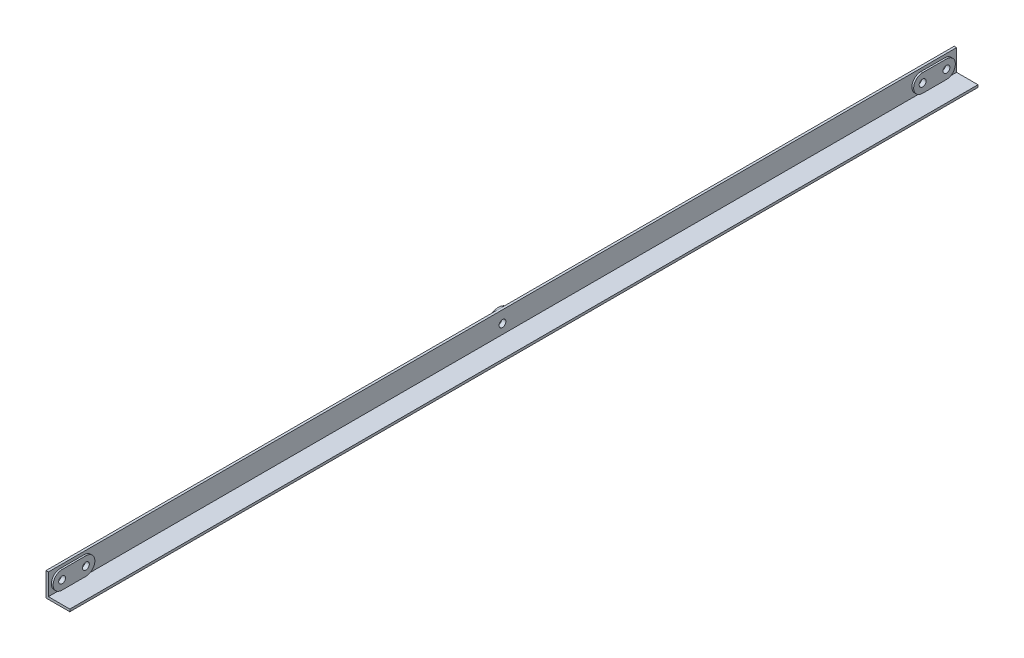
ISO-10303-21;
HEADER;
FILE_DESCRIPTION(('STEP AP214'),'2;1');
FILE_NAME('part.step','',(''),(''),'','','');
FILE_SCHEMA(('AUTOMOTIVE_DESIGN { 1 0 10303 214 1 1 1 1 }'));
ENDSEC;
DATA;
#1=APPLICATION_CONTEXT('core data for automotive mechanical design processes');
#2=APPLICATION_PROTOCOL_DEFINITION('international standard','automotive_design',2000,#1);
#3=PRODUCT_CONTEXT('',#1,'mechanical');
#4=PRODUCT('Part','Part','',(#3));
#5=PRODUCT_RELATED_PRODUCT_CATEGORY('part','',(#4));
#6=PRODUCT_DEFINITION_FORMATION('','',#4);
#7=PRODUCT_DEFINITION_CONTEXT('part definition',#1,'design');
#8=PRODUCT_DEFINITION('design','',#6,#7);
#9=PRODUCT_DEFINITION_SHAPE('','',#8);
#10=(LENGTH_UNIT() NAMED_UNIT(*) SI_UNIT(.MILLI.,.METRE.));
#11=(NAMED_UNIT(*) PLANE_ANGLE_UNIT() SI_UNIT($,.RADIAN.));
#12=(NAMED_UNIT(*) SI_UNIT($,.STERADIAN.) SOLID_ANGLE_UNIT());
#13=UNCERTAINTY_MEASURE_WITH_UNIT(LENGTH_MEASURE(1.E-05),#10,'distance_accuracy_value','');
#14=(GEOMETRIC_REPRESENTATION_CONTEXT(3) GLOBAL_UNCERTAINTY_ASSIGNED_CONTEXT((#13)) GLOBAL_UNIT_ASSIGNED_CONTEXT((#10,
#11,#12)) REPRESENTATION_CONTEXT('',''));
#15=CARTESIAN_POINT('',(0.,0.,0.));
#16=DIRECTION('',(0.,0.,1.));
#17=DIRECTION('',(1.,0.,0.));
#18=AXIS2_PLACEMENT_3D('',#15,#16,#17);
#19=CARTESIAN_POINT('',(0.,0.,3050.));
#20=DIRECTION('',(1.,0.,0.));
#21=DIRECTION('',(0.,0.,-1.));
#22=AXIS2_PLACEMENT_3D('',#19,#20,#21);
#23=PLANE('',#22);
#24=CARTESIAN_POINT('',(0.,40.,40.));
#25=DIRECTION('',(1.,0.,0.));
#26=DIRECTION('',(0.,0.,-1.));
#27=AXIS2_PLACEMENT_3D('',#24,#25,#26);
#28=CIRCLE('',#27,11.4999999999997);
#29=CARTESIAN_POINT('',(0.,40.,28.5000000000003));
#30=VERTEX_POINT('',#29);
#31=EDGE_CURVE('E284',#30,#30,#28,.T.);
#32=ORIENTED_EDGE('',*,*,#31,.T.);
#33=EDGE_LOOP('',(#32));
#34=FACE_BOUND('',#33,.T.);
#35=CARTESIAN_POINT('',(0.,40.,1525.));
#36=DIRECTION('',(-1.,0.,0.));
#37=DIRECTION('',(0.,0.,1.));
#38=AXIS2_PLACEMENT_3D('',#35,#36,#37);
#39=CIRCLE('',#38,39.9999999999999);
#40=CARTESIAN_POINT('',(0.,79.9999999999999,1525.));
#41=VERTEX_POINT('',#40);
#42=CARTESIAN_POINT('',(0.,0.,1525.));
#43=VERTEX_POINT('',#42);
#44=EDGE_CURVE('E222',#41,#43,#39,.T.);
#45=ORIENTED_EDGE('',*,*,#44,.F.);
#46=DIRECTION('',(0.,0.,-1.));
#47=VECTOR('',#46,1.);
#48=CARTESIAN_POINT('',(0.,80.,3050.));
#49=LINE('',#48,#47);
#50=CARTESIAN_POINT('',(0.,80.,0.));
#51=VERTEX_POINT('',#50);
#52=EDGE_CURVE('E259',#41,#51,#49,.T.);
#53=ORIENTED_EDGE('',*,*,#52,.T.);
#54=DIRECTION('',(0.,-1.,0.));
#55=VECTOR('',#54,1.);
#56=CARTESIAN_POINT('',(0.,0.,0.));
#57=LINE('',#56,#55);
#58=CARTESIAN_POINT('',(0.,0.,0.));
#59=VERTEX_POINT('',#58);
#60=EDGE_CURVE('E244',#51,#59,#57,.T.);
#61=ORIENTED_EDGE('',*,*,#60,.T.);
#62=DIRECTION('',(0.,0.,-1.));
#63=VECTOR('',#62,1.);
#64=CARTESIAN_POINT('',(0.,0.,3050.));
#65=LINE('',#64,#63);
#66=EDGE_CURVE('E274',#43,#59,#65,.T.);
#67=ORIENTED_EDGE('',*,*,#66,.F.);
#68=EDGE_LOOP('',(#45,#53,#61,#67));
#69=FACE_BOUND('',#68,.T.);
#70=CARTESIAN_POINT('',(0.,40.,120.));
#71=DIRECTION('',(1.,0.,0.));
#72=DIRECTION('',(0.,0.,-1.));
#73=AXIS2_PLACEMENT_3D('',#70,#71,#72);
#74=CIRCLE('',#73,11.4999999999997);
#75=CARTESIAN_POINT('',(0.,40.,108.5));
#76=VERTEX_POINT('',#75);
#77=EDGE_CURVE('E291',#76,#76,#74,.T.);
#78=ORIENTED_EDGE('',*,*,#77,.T.);
#79=EDGE_LOOP('',(#78));
#80=FACE_BOUND('',#79,.T.);
#81=ADVANCED_FACE('F34',(#34,#69,#80),#23,.F.);
#82=CARTESIAN_POINT('',(14.,40.,40.));
#83=DIRECTION('',(1.,0.,0.));
#84=DIRECTION('',(0.,1.,0.));
#85=AXIS2_PLACEMENT_3D('',#82,#83,#84);
#86=PLANE('',#85);
#87=CARTESIAN_POINT('',(14.,40.,40.));
#88=DIRECTION('',(1.,0.,0.));
#89=DIRECTION('',(0.,1.,0.));
#90=AXIS2_PLACEMENT_3D('',#87,#88,#89);
#91=CIRCLE('',#90,11.4999999999997);
#92=CARTESIAN_POINT('',(14.,51.4999999999997,40.));
#93=VERTEX_POINT('',#92);
#94=EDGE_CURVE('E173',#93,#93,#91,.F.);
#95=ORIENTED_EDGE('',*,*,#94,.T.);
#96=EDGE_LOOP('',(#95));
#97=FACE_BOUND('',#96,.T.);
#98=CARTESIAN_POINT('',(14.,40.,40.));
#99=DIRECTION('',(-1.,0.,0.));
#100=DIRECTION('',(0.,1.,0.));
#101=AXIS2_PLACEMENT_3D('',#98,#99,#100);
#102=CIRCLE('',#101,29.9999999999998);
#103=CARTESIAN_POINT('',(14.,70.,40.));
#104=VERTEX_POINT('',#103);
#105=CARTESIAN_POINT('',(14.,10.,40.));
#106=VERTEX_POINT('',#105);
#107=EDGE_CURVE('E180',#104,#106,#102,.T.);
#108=ORIENTED_EDGE('',*,*,#107,.F.);
#109=DIRECTION('',(0.,0.,-1.));
#110=VECTOR('',#109,1.);
#111=CARTESIAN_POINT('',(14.,70.,40.));
#112=LINE('',#111,#110);
#113=CARTESIAN_POINT('',(14.,69.9999999999998,120.));
#114=VERTEX_POINT('',#113);
#115=EDGE_CURVE('E151',#114,#104,#112,.T.);
#116=ORIENTED_EDGE('',*,*,#115,.F.);
#117=CARTESIAN_POINT('',(14.,40.,120.));
#118=DIRECTION('',(-1.,0.,0.));
#119=DIRECTION('',(0.,1.,0.));
#120=AXIS2_PLACEMENT_3D('',#117,#118,#119);
#121=CIRCLE('',#120,29.9999999999998);
#122=CARTESIAN_POINT('',(14.,10.,120.));
#123=VERTEX_POINT('',#122);
#124=EDGE_CURVE('E143',#123,#114,#121,.T.);
#125=ORIENTED_EDGE('',*,*,#124,.F.);
#126=DIRECTION('',(0.,0.,1.));
#127=VECTOR('',#126,1.);
#128=CARTESIAN_POINT('',(14.,10.,40.));
#129=LINE('',#128,#127);
#130=EDGE_CURVE('E149',#106,#123,#129,.T.);
#131=ORIENTED_EDGE('',*,*,#130,.F.);
#132=EDGE_LOOP('',(#108,#116,#125,#131));
#133=FACE_BOUND('',#132,.T.);
#134=CARTESIAN_POINT('',(14.,40.,120.));
#135=DIRECTION('',(1.,0.,0.));
#136=DIRECTION('',(0.,1.,0.));
#137=AXIS2_PLACEMENT_3D('',#134,#135,#136);
#138=CIRCLE('',#137,11.4999999999997);
#139=CARTESIAN_POINT('',(14.,51.4999999999997,120.));
#140=VERTEX_POINT('',#139);
#141=EDGE_CURVE('E37',#140,#140,#138,.F.);
#142=ORIENTED_EDGE('',*,*,#141,.T.);
#143=EDGE_LOOP('',(#142));
#144=FACE_BOUND('',#143,.T.);
#145=ADVANCED_FACE('F146',(#97,#133,#144),#86,.T.);
#146=CARTESIAN_POINT('',(14.,40.,40.));
#147=DIRECTION('',(-1.,0.,0.));
#148=DIRECTION('',(0.,-1.,0.));
#149=AXIS2_PLACEMENT_3D('',#146,#147,#148);
#150=CYLINDRICAL_SURFACE('',#149,29.9999999999998);
#151=CARTESIAN_POINT('',(8.,40.,40.));
#152=DIRECTION('',(-1.,0.,0.));
#153=DIRECTION('',(0.,1.,0.));
#154=AXIS2_PLACEMENT_3D('',#151,#152,#153);
#155=CIRCLE('',#154,29.9999999999998);
#156=CARTESIAN_POINT('',(8.,69.9999999999998,40.));
#157=VERTEX_POINT('',#156);
#158=CARTESIAN_POINT('',(8.00000000000001,10.0000000000002,40.));
#159=VERTEX_POINT('',#158);
#160=EDGE_CURVE('E154',#157,#159,#155,.T.);
#161=ORIENTED_EDGE('',*,*,#160,.F.);
#162=DIRECTION('',(-1.,0.,0.));
#163=VECTOR('',#162,1.);
#164=CARTESIAN_POINT('',(14.,70.,40.));
#165=LINE('',#164,#163);
#166=EDGE_CURVE('E176',#104,#157,#165,.T.);
#167=ORIENTED_EDGE('',*,*,#166,.F.);
#168=ORIENTED_EDGE('',*,*,#107,.T.);
#169=DIRECTION('',(-1.,0.,0.));
#170=VECTOR('',#169,1.);
#171=CARTESIAN_POINT('',(14.,10.,40.));
#172=LINE('',#171,#170);
#173=EDGE_CURVE('E50',#106,#159,#172,.T.);
#174=ORIENTED_EDGE('',*,*,#173,.T.);
#175=EDGE_LOOP('',(#161,#167,#168,#174));
#176=FACE_BOUND('',#175,.T.);
#177=ADVANCED_FACE('F313',(#176),#150,.T.);
#178=CARTESIAN_POINT('',(7.99999999999999,80.,0.));
#179=DIRECTION('',(-1.,0.,0.));
#180=DIRECTION('',(0.,-1.,0.));
#181=AXIS2_PLACEMENT_3D('',#178,#179,#180);
#182=PLANE('',#181);
#183=CARTESIAN_POINT('',(8.,40.,120.));
#184=DIRECTION('',(-1.,0.,0.));
#185=DIRECTION('',(0.,1.,0.));
#186=AXIS2_PLACEMENT_3D('',#183,#184,#185);
#187=CIRCLE('',#186,29.9999999999998);
#188=CARTESIAN_POINT('',(8.00000000000001,10.0000000000002,120.));
#189=VERTEX_POINT('',#188);
#190=CARTESIAN_POINT('',(8.,69.9999999999998,120.));
#191=VERTEX_POINT('',#190);
#192=EDGE_CURVE('E155',#189,#191,#187,.T.);
#193=ORIENTED_EDGE('',*,*,#192,.T.);
#194=DIRECTION('',(0.,0.,-1.));
#195=VECTOR('',#194,1.);
#196=CARTESIAN_POINT('',(7.99999999999999,70.,40.));
#197=LINE('',#196,#195);
#198=EDGE_CURVE('E57',#191,#157,#197,.T.);
#199=ORIENTED_EDGE('',*,*,#198,.T.);
#200=ORIENTED_EDGE('',*,*,#160,.T.);
#201=DIRECTION('',(0.,0.,1.));
#202=VECTOR('',#201,1.);
#203=CARTESIAN_POINT('',(8.00000000000001,10.,40.));
#204=LINE('',#203,#202);
#205=EDGE_CURVE('E168',#159,#189,#204,.T.);
#206=ORIENTED_EDGE('',*,*,#205,.T.);
#207=EDGE_LOOP('',(#193,#199,#200,#206));
#208=FACE_BOUND('',#207,.T.);
#209=DIRECTION('',(0.,-1.,0.));
#210=VECTOR('',#209,1.);
#211=CARTESIAN_POINT('',(7.99999999999999,80.,3050.));
#212=LINE('',#211,#210);
#213=CARTESIAN_POINT('',(7.99999999999999,80.,3050.));
#214=VERTEX_POINT('',#213);
#215=CARTESIAN_POINT('',(8.00000000000001,7.99999999999999,3050.));
#216=VERTEX_POINT('',#215);
#217=EDGE_CURVE('E226',#214,#216,#212,.T.);
#218=ORIENTED_EDGE('',*,*,#217,.T.);
#219=DIRECTION('',(0.,0.,1.));
#220=VECTOR('',#219,1.);
#221=CARTESIAN_POINT('',(8.00000000000001,7.99999999999999,0.));
#222=LINE('',#221,#220);
#223=CARTESIAN_POINT('',(8.00000000000001,7.99999999999999,0.));
#224=VERTEX_POINT('',#223);
#225=EDGE_CURVE('E245',#224,#216,#222,.T.);
#226=ORIENTED_EDGE('',*,*,#225,.F.);
#227=DIRECTION('',(0.,-1.,0.));
#228=VECTOR('',#227,1.);
#229=CARTESIAN_POINT('',(7.99999999999999,80.,0.));
#230=LINE('',#229,#228);
#231=CARTESIAN_POINT('',(7.99999999999999,80.,0.));
#232=VERTEX_POINT('',#231);
#233=EDGE_CURVE('E230',#232,#224,#230,.T.);
#234=ORIENTED_EDGE('',*,*,#233,.F.);
#235=DIRECTION('',(0.,0.,1.));
#236=VECTOR('',#235,1.);
#237=CARTESIAN_POINT('',(7.99999999999999,80.,0.));
#238=LINE('',#237,#236);
#239=EDGE_CURVE('E237',#232,#214,#238,.T.);
#240=ORIENTED_EDGE('',*,*,#239,.T.);
#241=EDGE_LOOP('',(#218,#226,#234,#240));
#242=FACE_BOUND('',#241,.T.);
#243=CARTESIAN_POINT('',(8.00000000000001,40.,1525.));
#244=DIRECTION('',(-1.,0.,0.));
#245=DIRECTION('',(0.,-1.,0.));
#246=AXIS2_PLACEMENT_3D('',#243,#244,#245);
#247=CIRCLE('',#246,11.5000000000002);
#248=CARTESIAN_POINT('',(8.00000000000001,28.4999999999998,1525.));
#249=VERTEX_POINT('',#248);
#250=EDGE_CURVE('E219',#249,#249,#247,.T.);
#251=ORIENTED_EDGE('',*,*,#250,.T.);
#252=EDGE_LOOP('',(#251));
#253=FACE_BOUND('',#252,.T.);
#254=DIRECTION('',(0.,0.,-1.));
#255=VECTOR('',#254,1.);
#256=CARTESIAN_POINT('',(8.00000000000001,10.,3010.));
#257=LINE('',#256,#255);
#258=CARTESIAN_POINT('',(8.00000000000001,10.,3010.));
#259=VERTEX_POINT('',#258);
#260=CARTESIAN_POINT('',(8.00000000000001,10.,2930.));
#261=VERTEX_POINT('',#260);
#262=EDGE_CURVE('E198',#259,#261,#257,.T.);
#263=ORIENTED_EDGE('',*,*,#262,.F.);
#264=CARTESIAN_POINT('',(8.,40.,3010.));
#265=DIRECTION('',(-1.,0.,0.));
#266=DIRECTION('',(0.,-1.,0.));
#267=AXIS2_PLACEMENT_3D('',#264,#265,#266);
#268=CIRCLE('',#267,29.9999999999998);
#269=CARTESIAN_POINT('',(7.99999999999999,70.,3010.));
#270=VERTEX_POINT('',#269);
#271=EDGE_CURVE('E42',#270,#259,#268,.F.);
#272=ORIENTED_EDGE('',*,*,#271,.F.);
#273=DIRECTION('',(0.,0.,1.));
#274=VECTOR('',#273,1.);
#275=CARTESIAN_POINT('',(7.99999999999999,70.,3010.));
#276=LINE('',#275,#274);
#277=CARTESIAN_POINT('',(7.99999999999999,70.,2930.));
#278=VERTEX_POINT('',#277);
#279=EDGE_CURVE('E195',#278,#270,#276,.T.);
#280=ORIENTED_EDGE('',*,*,#279,.F.);
#281=CARTESIAN_POINT('',(8.,40.,2930.));
#282=DIRECTION('',(-1.,0.,0.));
#283=DIRECTION('',(0.,-1.,0.));
#284=AXIS2_PLACEMENT_3D('',#281,#282,#283);
#285=CIRCLE('',#284,29.9999999999998);
#286=EDGE_CURVE('E11',#261,#278,#285,.F.);
#287=ORIENTED_EDGE('',*,*,#286,.F.);
#288=EDGE_LOOP('',(#263,#272,#280,#287));
#289=FACE_BOUND('',#288,.T.);
#290=ADVANCED_FACE('F363',(#208,#242,#253,#289),#182,.F.);
#291=CARTESIAN_POINT('',(14.,40.,3010.));
#292=DIRECTION('',(-1.,0.,0.));
#293=DIRECTION('',(0.,-1.,0.));
#294=AXIS2_PLACEMENT_3D('',#291,#292,#293);
#295=CYLINDRICAL_SURFACE('',#294,29.9999999999998);
#296=DIRECTION('',(-1.,0.,0.));
#297=VECTOR('',#296,1.);
#298=CARTESIAN_POINT('',(14.,10.,3010.));
#299=LINE('',#298,#297);
#300=CARTESIAN_POINT('',(14.,10.,3010.));
#301=VERTEX_POINT('',#300);
#302=EDGE_CURVE('E208',#301,#259,#299,.T.);
#303=ORIENTED_EDGE('',*,*,#302,.F.);
#304=CARTESIAN_POINT('',(14.,40.,3010.));
#305=DIRECTION('',(1.,0.,0.));
#306=DIRECTION('',(0.,1.,0.));
#307=AXIS2_PLACEMENT_3D('',#304,#305,#306);
#308=CIRCLE('',#307,29.9999999999998);
#309=CARTESIAN_POINT('',(14.,70.,3010.));
#310=VERTEX_POINT('',#309);
#311=EDGE_CURVE('E213',#310,#301,#308,.T.);
#312=ORIENTED_EDGE('',*,*,#311,.F.);
#313=DIRECTION('',(-1.,0.,0.));
#314=VECTOR('',#313,1.);
#315=CARTESIAN_POINT('',(14.,70.,3010.));
#316=LINE('',#315,#314);
#317=EDGE_CURVE('E197',#310,#270,#316,.T.);
#318=ORIENTED_EDGE('',*,*,#317,.T.);
#319=ORIENTED_EDGE('',*,*,#271,.T.);
#320=EDGE_LOOP('',(#303,#312,#318,#319));
#321=FACE_BOUND('',#320,.T.);
#322=ADVANCED_FACE('F326',(#321),#295,.T.);
#323=CARTESIAN_POINT('',(14.,40.,2930.));
#324=DIRECTION('',(-1.,0.,0.));
#325=DIRECTION('',(0.,-1.,0.));
#326=AXIS2_PLACEMENT_3D('',#323,#324,#325);
#327=CYLINDRICAL_SURFACE('',#326,29.9999999999998);
#328=DIRECTION('',(-1.,0.,0.));
#329=VECTOR('',#328,1.);
#330=CARTESIAN_POINT('',(14.,10.,2930.));
#331=LINE('',#330,#329);
#332=CARTESIAN_POINT('',(14.,10.0000000000002,2930.));
#333=VERTEX_POINT('',#332);
#334=EDGE_CURVE('E205',#333,#261,#331,.T.);
#335=ORIENTED_EDGE('',*,*,#334,.T.);
#336=ORIENTED_EDGE('',*,*,#286,.T.);
#337=DIRECTION('',(-1.,0.,0.));
#338=VECTOR('',#337,1.);
#339=CARTESIAN_POINT('',(14.,70.,2930.));
#340=LINE('',#339,#338);
#341=CARTESIAN_POINT('',(14.,70.,2930.));
#342=VERTEX_POINT('',#341);
#343=EDGE_CURVE('E203',#342,#278,#340,.T.);
#344=ORIENTED_EDGE('',*,*,#343,.F.);
#345=CARTESIAN_POINT('',(14.,40.,2930.));
#346=DIRECTION('',(1.,0.,0.));
#347=DIRECTION('',(0.,1.,0.));
#348=AXIS2_PLACEMENT_3D('',#345,#346,#347);
#349=CIRCLE('',#348,29.9999999999998);
#350=EDGE_CURVE('E210',#333,#342,#349,.T.);
#351=ORIENTED_EDGE('',*,*,#350,.F.);
#352=EDGE_LOOP('',(#335,#336,#344,#351));
#353=FACE_BOUND('',#352,.T.);
#354=ADVANCED_FACE('F318',(#353),#327,.T.);
#355=CARTESIAN_POINT('',(0.,40.,2930.));
#356=DIRECTION('',(-1.,0.,0.));
#357=DIRECTION('',(0.,0.,1.));
#358=AXIS2_PLACEMENT_3D('',#355,#356,#357);
#359=CIRCLE('',#358,11.4999999999997);
#360=CARTESIAN_POINT('',(0.,40.,2941.5));
#361=VERTEX_POINT('',#360);
#362=EDGE_CURVE('E182',#361,#361,#359,.T.);
#363=ORIENTED_EDGE('',*,*,#362,.F.);
#364=EDGE_LOOP('',(#363));
#365=FACE_BOUND('',#364,.T.);
#366=CARTESIAN_POINT('',(0.,40.,3010.));
#367=DIRECTION('',(-1.,0.,0.));
#368=DIRECTION('',(0.,0.,1.));
#369=AXIS2_PLACEMENT_3D('',#366,#367,#368);
#370=CIRCLE('',#369,11.4999999999997);
#371=CARTESIAN_POINT('',(0.,40.,3021.5));
#372=VERTEX_POINT('',#371);
#373=EDGE_CURVE('E187',#372,#372,#370,.T.);
#374=ORIENTED_EDGE('',*,*,#373,.F.);
#375=EDGE_LOOP('',(#374));
#376=FACE_BOUND('',#375,.T.);
#377=EDGE_CURVE('E229',#43,#41,#39,.T.);
#378=ORIENTED_EDGE('',*,*,#377,.F.);
#379=CARTESIAN_POINT('',(0.,0.,3050.));
#380=VERTEX_POINT('',#379);
#381=EDGE_CURVE('E275',#380,#43,#65,.T.);
#382=ORIENTED_EDGE('',*,*,#381,.F.);
#383=DIRECTION('',(0.,-1.,0.));
#384=VECTOR('',#383,1.);
#385=CARTESIAN_POINT('',(0.,0.,3050.));
#386=LINE('',#385,#384);
#387=CARTESIAN_POINT('',(0.,80.,3050.));
#388=VERTEX_POINT('',#387);
#389=EDGE_CURVE('E248',#388,#380,#386,.T.);
#390=ORIENTED_EDGE('',*,*,#389,.F.);
#391=EDGE_CURVE('E269',#388,#41,#49,.T.);
#392=ORIENTED_EDGE('',*,*,#391,.T.);
#393=EDGE_LOOP('',(#378,#382,#390,#392));
#394=FACE_BOUND('',#393,.T.);
#395=ADVANCED_FACE('F309',(#365,#376,#394),#23,.F.);
#396=CARTESIAN_POINT('',(0.,0.,3050.));
#397=DIRECTION('',(0.,1.,0.));
#398=DIRECTION('',(0.,0.,1.));
#399=AXIS2_PLACEMENT_3D('',#396,#397,#398);
#400=PLANE('',#399);
#401=DIRECTION('',(1.,0.,0.));
#402=VECTOR('',#401,1.);
#403=CARTESIAN_POINT('',(0.,0.,0.));
#404=LINE('',#403,#402);
#405=CARTESIAN_POINT('',(80.,0.,0.));
#406=VERTEX_POINT('',#405);
#407=EDGE_CURVE('E262',#59,#406,#404,.T.);
#408=ORIENTED_EDGE('',*,*,#407,.T.);
#409=DIRECTION('',(0.,0.,-1.));
#410=VECTOR('',#409,1.);
#411=CARTESIAN_POINT('',(80.,0.,3050.));
#412=LINE('',#411,#410);
#413=CARTESIAN_POINT('',(80.,0.,3050.));
#414=VERTEX_POINT('',#413);
#415=EDGE_CURVE('E271',#414,#406,#412,.T.);
#416=ORIENTED_EDGE('',*,*,#415,.F.);
#417=DIRECTION('',(1.,0.,0.));
#418=VECTOR('',#417,1.);
#419=CARTESIAN_POINT('',(0.,0.,3050.));
#420=LINE('',#419,#418);
#421=EDGE_CURVE('E251',#380,#414,#420,.T.);
#422=ORIENTED_EDGE('',*,*,#421,.F.);
#423=ORIENTED_EDGE('',*,*,#381,.T.);
#424=ORIENTED_EDGE('',*,*,#66,.T.);
#425=EDGE_LOOP('',(#408,#416,#422,#423,#424));
#426=FACE_BOUND('',#425,.T.);
#427=ADVANCED_FACE('F317',(#426),#400,.F.);
#428=CARTESIAN_POINT('',(80.,0.,3050.));
#429=DIRECTION('',(-1.,0.,0.));
#430=DIRECTION('',(0.,0.,1.));
#431=AXIS2_PLACEMENT_3D('',#428,#429,#430);
#432=PLANE('',#431);
#433=DIRECTION('',(0.,1.,0.));
#434=VECTOR('',#433,1.);
#435=CARTESIAN_POINT('',(80.,0.,0.));
#436=LINE('',#435,#434);
#437=CARTESIAN_POINT('',(80.,7.99999999999999,0.));
#438=VERTEX_POINT('',#437);
#439=EDGE_CURVE('E264',#406,#438,#436,.T.);
#440=ORIENTED_EDGE('',*,*,#439,.T.);
#441=DIRECTION('',(0.,0.,1.));
#442=VECTOR('',#441,1.);
#443=CARTESIAN_POINT('',(80.,7.99999999999999,0.));
#444=LINE('',#443,#442);
#445=CARTESIAN_POINT('',(80.,7.99999999999999,3050.));
#446=VERTEX_POINT('',#445);
#447=EDGE_CURVE('E241',#438,#446,#444,.T.);
#448=ORIENTED_EDGE('',*,*,#447,.T.);
#449=DIRECTION('',(0.,1.,0.));
#450=VECTOR('',#449,1.);
#451=CARTESIAN_POINT('',(80.,0.,3050.));
#452=LINE('',#451,#450);
#453=EDGE_CURVE('E254',#414,#446,#452,.T.);
#454=ORIENTED_EDGE('',*,*,#453,.F.);
#455=ORIENTED_EDGE('',*,*,#415,.T.);
#456=EDGE_LOOP('',(#440,#448,#454,#455));
#457=FACE_BOUND('',#456,.T.);
#458=ADVANCED_FACE('F324',(#457),#432,.F.);
#459=CARTESIAN_POINT('',(0.,80.,3050.));
#460=DIRECTION('',(0.,-1.,0.));
#461=DIRECTION('',(0.,0.,-1.));
#462=AXIS2_PLACEMENT_3D('',#459,#460,#461);
#463=PLANE('',#462);
#464=DIRECTION('',(-1.,0.,0.));
#465=VECTOR('',#464,1.);
#466=CARTESIAN_POINT('',(0.,80.,3050.));
#467=LINE('',#466,#465);
#468=EDGE_CURVE('E257',#214,#388,#467,.T.);
#469=ORIENTED_EDGE('',*,*,#468,.F.);
#470=ORIENTED_EDGE('',*,*,#239,.F.);
#471=DIRECTION('',(-1.,0.,0.));
#472=VECTOR('',#471,1.);
#473=CARTESIAN_POINT('',(0.,80.,0.));
#474=LINE('',#473,#472);
#475=EDGE_CURVE('E252',#232,#51,#474,.T.);
#476=ORIENTED_EDGE('',*,*,#475,.T.);
#477=ORIENTED_EDGE('',*,*,#52,.F.);
#478=ORIENTED_EDGE('',*,*,#391,.F.);
#479=EDGE_LOOP('',(#469,#470,#476,#477,#478));
#480=FACE_BOUND('',#479,.T.);
#481=ADVANCED_FACE('F369',(#480),#463,.F.);
#482=CARTESIAN_POINT('',(0.,0.,3050.));
#483=DIRECTION('',(0.,0.,-1.));
#484=DIRECTION('',(-1.,0.,0.));
#485=AXIS2_PLACEMENT_3D('',#482,#483,#484);
#486=PLANE('',#485);
#487=ORIENTED_EDGE('',*,*,#453,.T.);
#488=DIRECTION('',(1.,0.,0.));
#489=VECTOR('',#488,1.);
#490=CARTESIAN_POINT('',(80.,7.99999999999999,3050.));
#491=LINE('',#490,#489);
#492=EDGE_CURVE('E234',#216,#446,#491,.T.);
#493=ORIENTED_EDGE('',*,*,#492,.F.);
#494=ORIENTED_EDGE('',*,*,#217,.F.);
#495=ORIENTED_EDGE('',*,*,#468,.T.);
#496=ORIENTED_EDGE('',*,*,#389,.T.);
#497=ORIENTED_EDGE('',*,*,#421,.T.);
#498=EDGE_LOOP('',(#487,#493,#494,#495,#496,#497));
#499=FACE_BOUND('',#498,.T.);
#500=ADVANCED_FACE('F366',(#499),#486,.F.);
#501=CARTESIAN_POINT('',(0.,0.,0.));
#502=DIRECTION('',(0.,0.,-1.));
#503=DIRECTION('',(-1.,0.,0.));
#504=AXIS2_PLACEMENT_3D('',#501,#502,#503);
#505=PLANE('',#504);
#506=DIRECTION('',(1.,0.,0.));
#507=VECTOR('',#506,1.);
#508=CARTESIAN_POINT('',(80.,7.99999999999999,0.));
#509=LINE('',#508,#507);
#510=EDGE_CURVE('E233',#224,#438,#509,.T.);
#511=ORIENTED_EDGE('',*,*,#510,.T.);
#512=ORIENTED_EDGE('',*,*,#439,.F.);
#513=ORIENTED_EDGE('',*,*,#407,.F.);
#514=ORIENTED_EDGE('',*,*,#60,.F.);
#515=ORIENTED_EDGE('',*,*,#475,.F.);
#516=ORIENTED_EDGE('',*,*,#233,.T.);
#517=EDGE_LOOP('',(#511,#512,#513,#514,#515,#516));
#518=FACE_BOUND('',#517,.T.);
#519=ADVANCED_FACE('F357',(#518),#505,.T.);
#520=CARTESIAN_POINT('',(80.,7.99999999999999,0.));
#521=DIRECTION('',(0.,-1.,0.));
#522=DIRECTION('',(1.,0.,0.));
#523=AXIS2_PLACEMENT_3D('',#520,#521,#522);
#524=PLANE('',#523);
#525=ORIENTED_EDGE('',*,*,#492,.T.);
#526=ORIENTED_EDGE('',*,*,#447,.F.);
#527=ORIENTED_EDGE('',*,*,#510,.F.);
#528=ORIENTED_EDGE('',*,*,#225,.T.);
#529=EDGE_LOOP('',(#525,#526,#527,#528));
#530=FACE_BOUND('',#529,.T.);
#531=ADVANCED_FACE('F347',(#530),#524,.F.);
#532=CARTESIAN_POINT('',(-6.,40.,1525.));
#533=DIRECTION('',(1.,0.,0.));
#534=DIRECTION('',(0.,0.,-1.));
#535=AXIS2_PLACEMENT_3D('',#532,#533,#534);
#536=CYLINDRICAL_SURFACE('',#535,39.9999999999999);
#537=CARTESIAN_POINT('',(-6.,40.,1525.));
#538=DIRECTION('',(-1.,0.,0.));
#539=DIRECTION('',(0.,0.,1.));
#540=AXIS2_PLACEMENT_3D('',#537,#538,#539);
#541=CIRCLE('',#540,39.9999999999999);
#542=CARTESIAN_POINT('',(-6.,40.,1565.));
#543=VERTEX_POINT('',#542);
#544=EDGE_CURVE('E223',#543,#543,#541,.T.);
#545=ORIENTED_EDGE('',*,*,#544,.F.);
#546=EDGE_LOOP('',(#545));
#547=FACE_BOUND('',#546,.T.);
#548=ORIENTED_EDGE('',*,*,#44,.T.);
#549=ORIENTED_EDGE('',*,*,#377,.T.);
#550=EDGE_LOOP('',(#548,#549));
#551=FACE_BOUND('',#550,.T.);
#552=ADVANCED_FACE('F344',(#547,#551),#536,.T.);
#553=CARTESIAN_POINT('',(-6.,40.,1525.));
#554=DIRECTION('',(-1.,0.,0.));
#555=DIRECTION('',(0.,0.,1.));
#556=AXIS2_PLACEMENT_3D('',#553,#554,#555);
#557=PLANE('',#556);
#558=CARTESIAN_POINT('',(-6.,40.,1525.));
#559=DIRECTION('',(-1.,0.,0.));
#560=DIRECTION('',(0.,0.,1.));
#561=AXIS2_PLACEMENT_3D('',#558,#559,#560);
#562=CIRCLE('',#561,11.5000000000002);
#563=CARTESIAN_POINT('',(-6.,40.,1536.5));
#564=VERTEX_POINT('',#563);
#565=EDGE_CURVE('E216',#564,#564,#562,.T.);
#566=ORIENTED_EDGE('',*,*,#565,.F.);
#567=EDGE_LOOP('',(#566));
#568=FACE_BOUND('',#567,.T.);
#569=ORIENTED_EDGE('',*,*,#544,.T.);
#570=EDGE_LOOP('',(#569));
#571=FACE_BOUND('',#570,.T.);
#572=ADVANCED_FACE('F346',(#568,#571),#557,.T.);
#573=CARTESIAN_POINT('',(80.,40.,1525.));
#574=DIRECTION('',(-1.,0.,0.));
#575=DIRECTION('',(0.,0.,1.));
#576=AXIS2_PLACEMENT_3D('',#573,#574,#575);
#577=CYLINDRICAL_SURFACE('',#576,11.5000000000002);
#578=ORIENTED_EDGE('',*,*,#565,.T.);
#579=EDGE_LOOP('',(#578));
#580=FACE_BOUND('',#579,.T.);
#581=ORIENTED_EDGE('',*,*,#250,.F.);
#582=EDGE_LOOP('',(#581));
#583=FACE_BOUND('',#582,.T.);
#584=ADVANCED_FACE('F354',(#580,#583),#577,.F.);
#585=CARTESIAN_POINT('',(14.,40.,3010.));
#586=DIRECTION('',(1.,0.,0.));
#587=DIRECTION('',(0.,1.,0.));
#588=AXIS2_PLACEMENT_3D('',#585,#586,#587);
#589=PLANE('',#588);
#590=CARTESIAN_POINT('',(14.,40.,2930.));
#591=DIRECTION('',(1.,0.,0.));
#592=DIRECTION('',(0.,1.,0.));
#593=AXIS2_PLACEMENT_3D('',#590,#591,#592);
#594=CIRCLE('',#593,11.4999999999997);
#595=CARTESIAN_POINT('',(14.,51.4999999999997,2930.));
#596=VERTEX_POINT('',#595);
#597=EDGE_CURVE('E186',#596,#596,#594,.T.);
#598=ORIENTED_EDGE('',*,*,#597,.F.);
#599=EDGE_LOOP('',(#598));
#600=FACE_BOUND('',#599,.T.);
#601=CARTESIAN_POINT('',(14.,40.,3010.));
#602=DIRECTION('',(1.,0.,0.));
#603=DIRECTION('',(0.,1.,0.));
#604=AXIS2_PLACEMENT_3D('',#601,#602,#603);
#605=CIRCLE('',#604,11.4999999999997);
#606=CARTESIAN_POINT('',(14.,51.4999999999997,3010.));
#607=VERTEX_POINT('',#606);
#608=EDGE_CURVE('E190',#607,#607,#605,.T.);
#609=ORIENTED_EDGE('',*,*,#608,.F.);
#610=EDGE_LOOP('',(#609));
#611=FACE_BOUND('',#610,.T.);
#612=ORIENTED_EDGE('',*,*,#311,.T.);
#613=DIRECTION('',(0.,0.,-1.));
#614=VECTOR('',#613,1.);
#615=CARTESIAN_POINT('',(14.,10.,3010.));
#616=LINE('',#615,#614);
#617=EDGE_CURVE('E191',#301,#333,#616,.T.);
#618=ORIENTED_EDGE('',*,*,#617,.T.);
#619=ORIENTED_EDGE('',*,*,#350,.T.);
#620=DIRECTION('',(0.,0.,1.));
#621=VECTOR('',#620,1.);
#622=CARTESIAN_POINT('',(14.,70.,3010.));
#623=LINE('',#622,#621);
#624=EDGE_CURVE('E194',#342,#310,#623,.T.);
#625=ORIENTED_EDGE('',*,*,#624,.T.);
#626=EDGE_LOOP('',(#612,#618,#619,#625));
#627=FACE_BOUND('',#626,.T.);
#628=ADVANCED_FACE('F408',(#600,#611,#627),#589,.T.);
#629=CARTESIAN_POINT('',(14.,10.,3010.));
#630=DIRECTION('',(0.,1.,0.));
#631=DIRECTION('',(-1.,0.,0.));
#632=AXIS2_PLACEMENT_3D('',#629,#630,#631);
#633=PLANE('',#632);
#634=ORIENTED_EDGE('',*,*,#262,.T.);
#635=ORIENTED_EDGE('',*,*,#334,.F.);
#636=ORIENTED_EDGE('',*,*,#617,.F.);
#637=ORIENTED_EDGE('',*,*,#302,.T.);
#638=EDGE_LOOP('',(#634,#635,#636,#637));
#639=FACE_BOUND('',#638,.T.);
#640=ADVANCED_FACE('F406',(#639),#633,.F.);
#641=CARTESIAN_POINT('',(14.,70.,3010.));
#642=DIRECTION('',(0.,-1.,0.));
#643=DIRECTION('',(1.,0.,0.));
#644=AXIS2_PLACEMENT_3D('',#641,#642,#643);
#645=PLANE('',#644);
#646=ORIENTED_EDGE('',*,*,#279,.T.);
#647=ORIENTED_EDGE('',*,*,#317,.F.);
#648=ORIENTED_EDGE('',*,*,#624,.F.);
#649=ORIENTED_EDGE('',*,*,#343,.T.);
#650=EDGE_LOOP('',(#646,#647,#648,#649));
#651=FACE_BOUND('',#650,.T.);
#652=ADVANCED_FACE('F403',(#651),#645,.F.);
#653=CARTESIAN_POINT('',(80.,40.,3010.));
#654=DIRECTION('',(-1.,0.,0.));
#655=DIRECTION('',(0.,0.,1.));
#656=AXIS2_PLACEMENT_3D('',#653,#654,#655);
#657=CYLINDRICAL_SURFACE('',#656,11.4999999999997);
#658=ORIENTED_EDGE('',*,*,#608,.T.);
#659=EDGE_LOOP('',(#658));
#660=FACE_BOUND('',#659,.T.);
#661=ORIENTED_EDGE('',*,*,#373,.T.);
#662=EDGE_LOOP('',(#661));
#663=FACE_BOUND('',#662,.T.);
#664=ADVANCED_FACE('F448',(#660,#663),#657,.F.);
#665=CARTESIAN_POINT('',(80.,40.,2930.));
#666=DIRECTION('',(-1.,0.,0.));
#667=DIRECTION('',(0.,0.,1.));
#668=AXIS2_PLACEMENT_3D('',#665,#666,#667);
#669=CYLINDRICAL_SURFACE('',#668,11.4999999999997);
#670=ORIENTED_EDGE('',*,*,#597,.T.);
#671=EDGE_LOOP('',(#670));
#672=FACE_BOUND('',#671,.T.);
#673=ORIENTED_EDGE('',*,*,#362,.T.);
#674=EDGE_LOOP('',(#673));
#675=FACE_BOUND('',#674,.T.);
#676=ADVANCED_FACE('F468',(#672,#675),#669,.F.);
#677=CARTESIAN_POINT('',(14.,40.,120.));
#678=DIRECTION('',(-1.,0.,0.));
#679=DIRECTION('',(0.,-1.,0.));
#680=AXIS2_PLACEMENT_3D('',#677,#678,#679);
#681=CYLINDRICAL_SURFACE('',#680,29.9999999999998);
#682=DIRECTION('',(-1.,0.,0.));
#683=VECTOR('',#682,1.);
#684=CARTESIAN_POINT('',(14.,70.,120.));
#685=LINE('',#684,#683);
#686=EDGE_CURVE('E163',#114,#191,#685,.T.);
#687=ORIENTED_EDGE('',*,*,#686,.T.);
#688=ORIENTED_EDGE('',*,*,#192,.F.);
#689=DIRECTION('',(-1.,0.,0.));
#690=VECTOR('',#689,1.);
#691=CARTESIAN_POINT('',(14.,10.,120.));
#692=LINE('',#691,#690);
#693=EDGE_CURVE('E159',#123,#189,#692,.T.);
#694=ORIENTED_EDGE('',*,*,#693,.F.);
#695=ORIENTED_EDGE('',*,*,#124,.T.);
#696=EDGE_LOOP('',(#687,#688,#694,#695));
#697=FACE_BOUND('',#696,.T.);
#698=ADVANCED_FACE('F160',(#697),#681,.T.);
#699=CARTESIAN_POINT('',(14.,70.,40.));
#700=DIRECTION('',(0.,1.,0.));
#701=DIRECTION('',(-1.,0.,0.));
#702=AXIS2_PLACEMENT_3D('',#699,#700,#701);
#703=PLANE('',#702);
#704=ORIENTED_EDGE('',*,*,#198,.F.);
#705=ORIENTED_EDGE('',*,*,#686,.F.);
#706=ORIENTED_EDGE('',*,*,#115,.T.);
#707=ORIENTED_EDGE('',*,*,#166,.T.);
#708=EDGE_LOOP('',(#704,#705,#706,#707));
#709=FACE_BOUND('',#708,.T.);
#710=ADVANCED_FACE('F511',(#709),#703,.T.);
#711=CARTESIAN_POINT('',(14.,10.,40.));
#712=DIRECTION('',(0.,-1.,0.));
#713=DIRECTION('',(1.,0.,0.));
#714=AXIS2_PLACEMENT_3D('',#711,#712,#713);
#715=PLANE('',#714);
#716=ORIENTED_EDGE('',*,*,#205,.F.);
#717=ORIENTED_EDGE('',*,*,#173,.F.);
#718=ORIENTED_EDGE('',*,*,#130,.T.);
#719=ORIENTED_EDGE('',*,*,#693,.T.);
#720=EDGE_LOOP('',(#716,#717,#718,#719));
#721=FACE_BOUND('',#720,.T.);
#722=ADVANCED_FACE('F165',(#721),#715,.T.);
#723=CARTESIAN_POINT('',(80.,40.,40.));
#724=DIRECTION('',(-1.,0.,0.));
#725=DIRECTION('',(0.,0.,1.));
#726=AXIS2_PLACEMENT_3D('',#723,#724,#725);
#727=CYLINDRICAL_SURFACE('',#726,11.4999999999997);
#728=ORIENTED_EDGE('',*,*,#94,.F.);
#729=EDGE_LOOP('',(#728));
#730=FACE_BOUND('',#729,.T.);
#731=ORIENTED_EDGE('',*,*,#31,.F.);
#732=EDGE_LOOP('',(#731));
#733=FACE_BOUND('',#732,.T.);
#734=ADVANCED_FACE('F299',(#730,#733),#727,.F.);
#735=CARTESIAN_POINT('',(80.,40.,120.));
#736=DIRECTION('',(-1.,0.,0.));
#737=DIRECTION('',(0.,0.,1.));
#738=AXIS2_PLACEMENT_3D('',#735,#736,#737);
#739=CYLINDRICAL_SURFACE('',#738,11.4999999999997);
#740=ORIENTED_EDGE('',*,*,#141,.F.);
#741=EDGE_LOOP('',(#740));
#742=FACE_BOUND('',#741,.T.);
#743=ORIENTED_EDGE('',*,*,#77,.F.);
#744=EDGE_LOOP('',(#743));
#745=FACE_BOUND('',#744,.T.);
#746=ADVANCED_FACE('F297',(#742,#745),#739,.F.);
#747=CLOSED_SHELL('',(#81,#145,#177,#290,#322,#354,#395,#427,#458,#481,#500,#519,#531,#552,#572,
#584,#628,#640,#652,#664,#676,#698,#710,#722,#734,#746));
#748=MANIFOLD_SOLID_BREP('B2',#747);
#749=ADVANCED_BREP_SHAPE_REPRESENTATION('',(#18,#748),#14);
#750=SHAPE_DEFINITION_REPRESENTATION(#9,#749);
ENDSEC;
END-ISO-10303-21;
